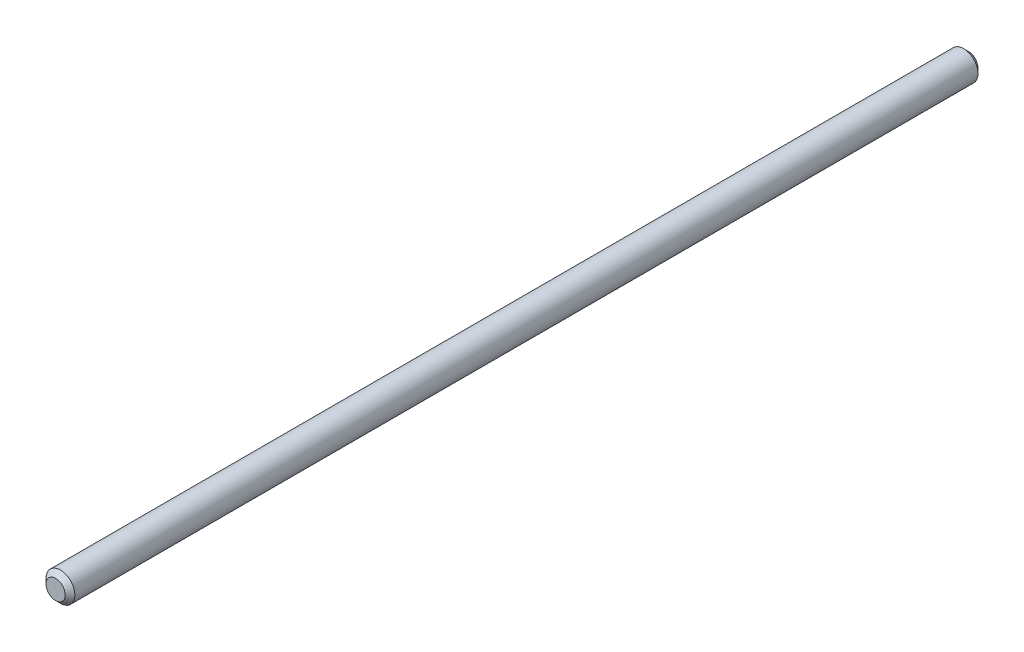
ISO-10303-21;
HEADER;
FILE_DESCRIPTION(('STEP AP214'),'2;1');
FILE_NAME('part.step','',(''),(''),'','','');
FILE_SCHEMA(('AUTOMOTIVE_DESIGN { 1 0 10303 214 1 1 1 1 }'));
ENDSEC;
DATA;
#1=APPLICATION_CONTEXT('core data for automotive mechanical design processes');
#2=APPLICATION_PROTOCOL_DEFINITION('international standard','automotive_design',2000,#1);
#3=PRODUCT_CONTEXT('',#1,'mechanical');
#4=PRODUCT('Part','Part','',(#3));
#5=PRODUCT_RELATED_PRODUCT_CATEGORY('part','',(#4));
#6=PRODUCT_DEFINITION_FORMATION('','',#4);
#7=PRODUCT_DEFINITION_CONTEXT('part definition',#1,'design');
#8=PRODUCT_DEFINITION('design','',#6,#7);
#9=PRODUCT_DEFINITION_SHAPE('','',#8);
#10=(LENGTH_UNIT() NAMED_UNIT(*) SI_UNIT(.MILLI.,.METRE.));
#11=(NAMED_UNIT(*) PLANE_ANGLE_UNIT() SI_UNIT($,.RADIAN.));
#12=(NAMED_UNIT(*) SI_UNIT($,.STERADIAN.) SOLID_ANGLE_UNIT());
#13=UNCERTAINTY_MEASURE_WITH_UNIT(LENGTH_MEASURE(1.E-05),#10,'distance_accuracy_value','');
#14=(GEOMETRIC_REPRESENTATION_CONTEXT(3) GLOBAL_UNCERTAINTY_ASSIGNED_CONTEXT((#13)) GLOBAL_UNIT_ASSIGNED_CONTEXT((#10,
#11,#12)) REPRESENTATION_CONTEXT('',''));
#15=CARTESIAN_POINT('',(0.,0.,0.));
#16=DIRECTION('',(0.,0.,1.));
#17=DIRECTION('',(1.,0.,0.));
#18=AXIS2_PLACEMENT_3D('',#15,#16,#17);
#19=CARTESIAN_POINT('',(0.,0.,94.85));
#20=DIRECTION('',(0.,0.,-1.));
#21=DIRECTION('',(-1.,0.,0.));
#22=AXIS2_PLACEMENT_3D('',#19,#20,#21);
#23=CYLINDRICAL_SURFACE('',#22,3.);
#24=CARTESIAN_POINT('',(0.,0.,-93.85));
#25=DIRECTION('',(0.,0.,1.));
#26=DIRECTION('',(1.,0.,0.));
#27=AXIS2_PLACEMENT_3D('',#24,#25,#26);
#28=CIRCLE('',#27,3.);
#29=CARTESIAN_POINT('',(3.,0.,-93.85));
#30=VERTEX_POINT('',#29);
#31=EDGE_CURVE('E41',#30,#30,#28,.T.);
#32=ORIENTED_EDGE('',*,*,#31,.T.);
#33=EDGE_LOOP('',(#32));
#34=FACE_BOUND('',#33,.T.);
#35=CARTESIAN_POINT('',(0.,0.,93.85));
#36=DIRECTION('',(0.,0.,1.));
#37=DIRECTION('',(1.,0.,0.));
#38=AXIS2_PLACEMENT_3D('',#35,#36,#37);
#39=CIRCLE('',#38,3.);
#40=CARTESIAN_POINT('',(3.,0.,93.85));
#41=VERTEX_POINT('',#40);
#42=EDGE_CURVE('E45',#41,#41,#39,.F.);
#43=ORIENTED_EDGE('',*,*,#42,.T.);
#44=EDGE_LOOP('',(#43));
#45=FACE_BOUND('',#44,.T.);
#46=ADVANCED_FACE('F30',(#34,#45),#23,.T.);
#47=CARTESIAN_POINT('',(0.,0.,94.85));
#48=DIRECTION('',(0.,0.,1.));
#49=DIRECTION('',(1.,0.,0.));
#50=AXIS2_PLACEMENT_3D('',#47,#48,#49);
#51=PLANE('',#50);
#52=CARTESIAN_POINT('',(0.,0.,94.85));
#53=DIRECTION('',(0.,0.,1.));
#54=DIRECTION('',(1.,0.,0.));
#55=AXIS2_PLACEMENT_3D('',#52,#53,#54);
#56=CIRCLE('',#55,2.);
#57=CARTESIAN_POINT('',(2.,0.,94.85));
#58=VERTEX_POINT('',#57);
#59=EDGE_CURVE('E10',#58,#58,#56,.T.);
#60=ORIENTED_EDGE('',*,*,#59,.T.);
#61=EDGE_LOOP('',(#60));
#62=FACE_BOUND('',#61,.T.);
#63=ADVANCED_FACE('F61',(#62),#51,.T.);
#64=CARTESIAN_POINT('',(0.,0.,-94.85));
#65=DIRECTION('',(0.,0.,1.));
#66=DIRECTION('',(1.,0.,0.));
#67=AXIS2_PLACEMENT_3D('',#64,#65,#66);
#68=PLANE('',#67);
#69=CARTESIAN_POINT('',(0.,0.,-94.85));
#70=DIRECTION('',(0.,0.,1.));
#71=DIRECTION('',(1.,0.,0.));
#72=AXIS2_PLACEMENT_3D('',#69,#70,#71);
#73=CIRCLE('',#72,2.00000000000003);
#74=CARTESIAN_POINT('',(2.00000000000003,0.,-94.85));
#75=VERTEX_POINT('',#74);
#76=EDGE_CURVE('E37',#75,#75,#73,.F.);
#77=ORIENTED_EDGE('',*,*,#76,.T.);
#78=EDGE_LOOP('',(#77));
#79=FACE_BOUND('',#78,.T.);
#80=ADVANCED_FACE('F58',(#79),#68,.F.);
#81=CARTESIAN_POINT('',(0.,0.,-93.85));
#82=DIRECTION('',(0.,0.,1.));
#83=DIRECTION('',(1.,0.,0.));
#84=AXIS2_PLACEMENT_3D('',#81,#82,#83);
#85=CONICAL_SURFACE('',#84,3.,0.785398163397433);
#86=ORIENTED_EDGE('',*,*,#76,.F.);
#87=EDGE_LOOP('',(#86));
#88=FACE_BOUND('',#87,.T.);
#89=ORIENTED_EDGE('',*,*,#31,.F.);
#90=EDGE_LOOP('',(#89));
#91=FACE_BOUND('',#90,.T.);
#92=ADVANCED_FACE('F54',(#88,#91),#85,.T.);
#93=CARTESIAN_POINT('',(0.,0.,94.85));
#94=DIRECTION('',(0.,0.,-1.));
#95=DIRECTION('',(-1.,0.,0.));
#96=AXIS2_PLACEMENT_3D('',#93,#94,#95);
#97=CONICAL_SURFACE('',#96,2.,0.78539816339744);
#98=ORIENTED_EDGE('',*,*,#42,.F.);
#99=EDGE_LOOP('',(#98));
#100=FACE_BOUND('',#99,.T.);
#101=ORIENTED_EDGE('',*,*,#59,.F.);
#102=EDGE_LOOP('',(#101));
#103=FACE_BOUND('',#102,.T.);
#104=ADVANCED_FACE('F32',(#100,#103),#97,.T.);
#105=CLOSED_SHELL('',(#46,#63,#80,#92,#104));
#106=MANIFOLD_SOLID_BREP('B2',#105);
#107=ADVANCED_BREP_SHAPE_REPRESENTATION('',(#18,#106),#14);
#108=SHAPE_DEFINITION_REPRESENTATION(#9,#107);
ENDSEC;
END-ISO-10303-21;
